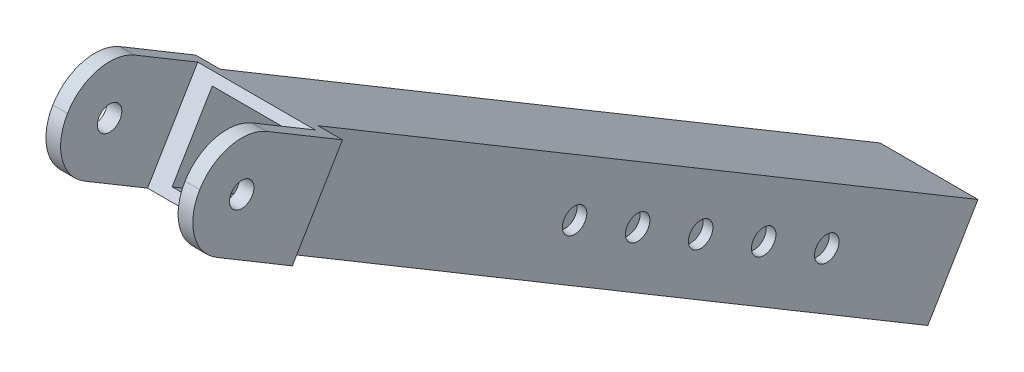
ISO-10303-21;
HEADER;
FILE_DESCRIPTION(('STEP AP214'),'2;1');
FILE_NAME('part.step','',(''),(''),'','','');
FILE_SCHEMA(('AUTOMOTIVE_DESIGN { 1 0 10303 214 1 1 1 1 }'));
ENDSEC;
DATA;
#1=APPLICATION_CONTEXT('core data for automotive mechanical design processes');
#2=APPLICATION_PROTOCOL_DEFINITION('international standard','automotive_design',2000,#1);
#3=PRODUCT_CONTEXT('',#1,'mechanical');
#4=PRODUCT('Part','Part','',(#3));
#5=PRODUCT_RELATED_PRODUCT_CATEGORY('part','',(#4));
#6=PRODUCT_DEFINITION_FORMATION('','',#4);
#7=PRODUCT_DEFINITION_CONTEXT('part definition',#1,'design');
#8=PRODUCT_DEFINITION('design','',#6,#7);
#9=PRODUCT_DEFINITION_SHAPE('','',#8);
#10=(LENGTH_UNIT() NAMED_UNIT(*) SI_UNIT(.MILLI.,.METRE.));
#11=(NAMED_UNIT(*) PLANE_ANGLE_UNIT() SI_UNIT($,.RADIAN.));
#12=(NAMED_UNIT(*) SI_UNIT($,.STERADIAN.) SOLID_ANGLE_UNIT());
#13=UNCERTAINTY_MEASURE_WITH_UNIT(LENGTH_MEASURE(1.E-05),#10,'distance_accuracy_value','');
#14=(GEOMETRIC_REPRESENTATION_CONTEXT(3) GLOBAL_UNCERTAINTY_ASSIGNED_CONTEXT((#13)) GLOBAL_UNIT_ASSIGNED_CONTEXT((#10,
#11,#12)) REPRESENTATION_CONTEXT('',''));
#15=CARTESIAN_POINT('',(0.,0.,0.));
#16=DIRECTION('',(0.,0.,1.));
#17=DIRECTION('',(1.,0.,0.));
#18=AXIS2_PLACEMENT_3D('',#15,#16,#17);
#19=CARTESIAN_POINT('',(0.,-20.5142800548705,-34.3735872736721));
#20=DIRECTION('',(0.,-0.512476118802119,-0.858701477614611));
#21=DIRECTION('',(0.,0.858701477614611,-0.512476118802119));
#22=AXIS2_PLACEMENT_3D('',#19,#20,#21);
#23=PLANE('',#22);
#24=DIRECTION('',(0.,-0.858701477614611,0.512476118802119));
#25=VECTOR('',#24,1.);
#26=CARTESIAN_POINT('',(8.,84.8531726792752,-97.2572606257464));
#27=LINE('',#26,#25);
#28=CARTESIAN_POINT('',(8.,98.592396321109,-105.45687852658));
#29=VERTEX_POINT('',#28);
#30=CARTESIAN_POINT('',(8.,84.8531726792752,-97.2572606257464));
#31=VERTEX_POINT('',#30);
#32=EDGE_CURVE('E350',#29,#31,#27,.T.);
#33=ORIENTED_EDGE('',*,*,#32,.T.);
#34=DIRECTION('',(-1.,0.,0.));
#35=VECTOR('',#34,1.);
#36=CARTESIAN_POINT('',(-8.,84.8531726792752,-97.2572606257464));
#37=LINE('',#36,#35);
#38=CARTESIAN_POINT('',(-8.,84.8531726792752,-97.2572606257464));
#39=VERTEX_POINT('',#38);
#40=EDGE_CURVE('E340',#31,#39,#37,.T.);
#41=ORIENTED_EDGE('',*,*,#40,.T.);
#42=DIRECTION('',(0.,0.858701477614611,-0.512476118802119));
#43=VECTOR('',#42,1.);
#44=CARTESIAN_POINT('',(-8.,84.8531726792752,-97.2572606257464));
#45=LINE('',#44,#43);
#46=CARTESIAN_POINT('',(-8.,98.592396321109,-105.45687852658));
#47=VERTEX_POINT('',#46);
#48=EDGE_CURVE('E343',#39,#47,#45,.T.);
#49=ORIENTED_EDGE('',*,*,#48,.T.);
#50=DIRECTION('',(1.,0.,0.));
#51=VECTOR('',#50,1.);
#52=CARTESIAN_POINT('',(-8.,98.592396321109,-105.45687852658));
#53=LINE('',#52,#51);
#54=EDGE_CURVE('E347',#47,#29,#53,.T.);
#55=ORIENTED_EDGE('',*,*,#54,.T.);
#56=EDGE_LOOP('',(#33,#41,#49,#55));
#57=FACE_BOUND('',#56,.T.);
#58=DIRECTION('',(0.,-0.858701477614611,0.512476118802119));
#59=VECTOR('',#58,1.);
#60=CARTESIAN_POINT('',(12.,100.309799276338,-106.481830764185));
#61=LINE('',#60,#59);
#62=CARTESIAN_POINT('',(12.,100.309799276338,-106.481830764184));
#63=VERTEX_POINT('',#62);
#64=CARTESIAN_POINT('',(12.,83.135769724046,-96.2323083881421));
#65=VERTEX_POINT('',#64);
#66=EDGE_CURVE('E273',#63,#65,#61,.T.);
#67=ORIENTED_EDGE('',*,*,#66,.F.);
#68=DIRECTION('',(1.,0.,0.));
#69=VECTOR('',#68,1.);
#70=CARTESIAN_POINT('',(-10.,100.309799276338,-106.481830764184));
#71=LINE('',#70,#69);
#72=CARTESIAN_POINT('',(-12.,100.309799276338,-106.481830764184));
#73=VERTEX_POINT('',#72);
#74=EDGE_CURVE('E209',#73,#63,#71,.T.);
#75=ORIENTED_EDGE('',*,*,#74,.F.);
#76=DIRECTION('',(0.,0.858701477614611,-0.512476118802119));
#77=VECTOR('',#76,1.);
#78=CARTESIAN_POINT('',(-12.,100.309799276338,-106.481830764185));
#79=LINE('',#78,#77);
#80=CARTESIAN_POINT('',(-12.,83.135769724046,-96.2323083881421));
#81=VERTEX_POINT('',#80);
#82=EDGE_CURVE('E276',#81,#73,#79,.T.);
#83=ORIENTED_EDGE('',*,*,#82,.F.);
#84=DIRECTION('',(-1.,0.,0.));
#85=VECTOR('',#84,1.);
#86=CARTESIAN_POINT('',(-10.,83.135769724046,-96.2323083881421));
#87=LINE('',#86,#85);
#88=EDGE_CURVE('E371',#65,#81,#87,.T.);
#89=ORIENTED_EDGE('',*,*,#88,.F.);
#90=EDGE_LOOP('',(#67,#75,#83,#89));
#91=FACE_BOUND('',#90,.T.);
#92=ADVANCED_FACE('F41',(#57,#91),#23,.F.);
#93=CARTESIAN_POINT('',(10.,83.135769724046,-96.2323083881421));
#94=DIRECTION('',(1.,0.,0.));
#95=DIRECTION('',(0.,0.,-1.));
#96=AXIS2_PLACEMENT_3D('',#93,#94,#95);
#97=PLANE('',#96);
#98=CARTESIAN_POINT('',(10.,25.1008890559165,-212.988261666063));
#99=DIRECTION('',(1.,0.,0.));
#100=DIRECTION('',(0.,0.,-1.));
#101=AXIS2_PLACEMENT_3D('',#98,#99,#100);
#102=CIRCLE('',#101,2.5);
#103=CARTESIAN_POINT('',(10.,25.1008890559165,-215.488261666063));
#104=VERTEX_POINT('',#103);
#105=EDGE_CURVE('E229',#104,#104,#102,.T.);
#106=ORIENTED_EDGE('',*,*,#105,.F.);
#107=EDGE_LOOP('',(#106));
#108=FACE_BOUND('',#107,.T.);
#109=CARTESIAN_POINT('',(10.,32.7880308379483,-200.107739501844));
#110=DIRECTION('',(1.,0.,0.));
#111=DIRECTION('',(0.,0.,-1.));
#112=AXIS2_PLACEMENT_3D('',#109,#110,#111);
#113=CIRCLE('',#112,2.5);
#114=CARTESIAN_POINT('',(10.,32.7880308379483,-202.607739501844));
#115=VERTEX_POINT('',#114);
#116=EDGE_CURVE('E224',#115,#115,#113,.T.);
#117=ORIENTED_EDGE('',*,*,#116,.F.);
#118=EDGE_LOOP('',(#117));
#119=FACE_BOUND('',#118,.T.);
#120=CARTESIAN_POINT('',(10.,40.4751726199801,-187.227217337624));
#121=DIRECTION('',(1.,0.,0.));
#122=DIRECTION('',(0.,0.,-1.));
#123=AXIS2_PLACEMENT_3D('',#120,#121,#122);
#124=CIRCLE('',#123,2.5);
#125=CARTESIAN_POINT('',(10.,40.4751726199801,-189.727217337624));
#126=VERTEX_POINT('',#125);
#127=EDGE_CURVE('E219',#126,#126,#124,.T.);
#128=ORIENTED_EDGE('',*,*,#127,.F.);
#129=EDGE_LOOP('',(#128));
#130=FACE_BOUND('',#129,.T.);
#131=CARTESIAN_POINT('',(10.,48.1623144020119,-174.346695173405));
#132=DIRECTION('',(1.,0.,0.));
#133=DIRECTION('',(0.,0.,-1.));
#134=AXIS2_PLACEMENT_3D('',#131,#132,#133);
#135=CIRCLE('',#134,2.5);
#136=CARTESIAN_POINT('',(10.,48.1623144020119,-176.846695173405));
#137=VERTEX_POINT('',#136);
#138=EDGE_CURVE('E214',#137,#137,#135,.T.);
#139=ORIENTED_EDGE('',*,*,#138,.F.);
#140=EDGE_LOOP('',(#139));
#141=FACE_BOUND('',#140,.T.);
#142=CARTESIAN_POINT('',(10.,55.8494561840437,-161.466173009186));
#143=DIRECTION('',(1.,0.,0.));
#144=DIRECTION('',(0.,0.,-1.));
#145=AXIS2_PLACEMENT_3D('',#142,#143,#144);
#146=CIRCLE('',#145,2.5);
#147=CARTESIAN_POINT('',(10.,55.8494561840437,-163.966173009186));
#148=VERTEX_POINT('',#147);
#149=EDGE_CURVE('E336',#148,#148,#146,.T.);
#150=ORIENTED_EDGE('',*,*,#149,.F.);
#151=EDGE_LOOP('',(#150));
#152=FACE_BOUND('',#151,.T.);
#153=DIRECTION('',(0.,-0.512476118802119,-0.858701477614611));
#154=VECTOR('',#153,1.);
#155=CARTESIAN_POINT('',(10.,100.309799276338,-106.481830764184));
#156=LINE('',#155,#154);
#157=CARTESIAN_POINT('',(10.,98.7723709199318,-109.057935197028));
#158=VERTEX_POINT('',#157);
#159=CARTESIAN_POINT('',(10.,18.3136202679991,-243.874067182522));
#160=VERTEX_POINT('',#159);
#161=EDGE_CURVE('E183',#158,#160,#156,.T.);
#162=ORIENTED_EDGE('',*,*,#161,.F.);
#163=DIRECTION('',(0.,-0.858701477614611,0.512476118802119));
#164=VECTOR('',#163,1.);
#165=CARTESIAN_POINT('',(10.,81.5983413676396,-98.808412820986));
#166=LINE('',#165,#164);
#167=CARTESIAN_POINT('',(10.,81.5983413676396,-98.808412820986));
#168=VERTEX_POINT('',#167);
#169=EDGE_CURVE('E167',#158,#168,#166,.T.);
#170=ORIENTED_EDGE('',*,*,#169,.T.);
#171=DIRECTION('',(0.,-0.512476118802119,-0.858701477614611));
#172=VECTOR('',#171,1.);
#173=CARTESIAN_POINT('',(10.,83.135769724046,-96.2323083881421));
#174=LINE('',#173,#172);
#175=CARTESIAN_POINT('',(10.,1.13959071570686,-233.62454480648));
#176=VERTEX_POINT('',#175);
#177=EDGE_CURVE('E207',#168,#176,#174,.T.);
#178=ORIENTED_EDGE('',*,*,#177,.T.);
#179=DIRECTION('',(0.,-0.858701477614611,0.512476118802119));
#180=VECTOR('',#179,1.);
#181=CARTESIAN_POINT('',(10.,1.13959071570686,-233.62454480648));
#182=LINE('',#181,#180);
#183=EDGE_CURVE('E193',#160,#176,#182,.T.);
#184=ORIENTED_EDGE('',*,*,#183,.F.);
#185=EDGE_LOOP('',(#162,#170,#178,#184));
#186=FACE_BOUND('',#185,.T.);
#187=ADVANCED_FACE('F191',(#108,#119,#130,#141,#152,#186),#97,.T.);
#188=CARTESIAN_POINT('',(-10.,83.135769724046,-96.2323083881421));
#189=DIRECTION('',(-1.,0.,0.));
#190=DIRECTION('',(0.,0.,1.));
#191=AXIS2_PLACEMENT_3D('',#188,#189,#190);
#192=PLANE('',#191);
#193=CARTESIAN_POINT('',(-10.,25.1008890559165,-212.988261666063));
#194=DIRECTION('',(-1.,0.,0.));
#195=DIRECTION('',(0.,0.,1.));
#196=AXIS2_PLACEMENT_3D('',#193,#194,#195);
#197=CIRCLE('',#196,2.5);
#198=CARTESIAN_POINT('',(-10.,25.1008890559165,-210.488261666063));
#199=VERTEX_POINT('',#198);
#200=EDGE_CURVE('E305',#199,#199,#197,.T.);
#201=ORIENTED_EDGE('',*,*,#200,.F.);
#202=EDGE_LOOP('',(#201));
#203=FACE_BOUND('',#202,.T.);
#204=CARTESIAN_POINT('',(-10.,32.7880308379483,-200.107739501844));
#205=DIRECTION('',(-1.,0.,0.));
#206=DIRECTION('',(0.,0.,1.));
#207=AXIS2_PLACEMENT_3D('',#204,#205,#206);
#208=CIRCLE('',#207,2.5);
#209=CARTESIAN_POINT('',(-10.,32.7880308379483,-197.607739501844));
#210=VERTEX_POINT('',#209);
#211=EDGE_CURVE('E312',#210,#210,#208,.T.);
#212=ORIENTED_EDGE('',*,*,#211,.F.);
#213=EDGE_LOOP('',(#212));
#214=FACE_BOUND('',#213,.T.);
#215=CARTESIAN_POINT('',(-10.,40.4751726199801,-187.227217337624));
#216=DIRECTION('',(-1.,0.,0.));
#217=DIRECTION('',(0.,0.,1.));
#218=AXIS2_PLACEMENT_3D('',#215,#216,#217);
#219=CIRCLE('',#218,2.5);
#220=CARTESIAN_POINT('',(-10.,40.4751726199801,-184.727217337624));
#221=VERTEX_POINT('',#220);
#222=EDGE_CURVE('E319',#221,#221,#219,.T.);
#223=ORIENTED_EDGE('',*,*,#222,.F.);
#224=EDGE_LOOP('',(#223));
#225=FACE_BOUND('',#224,.T.);
#226=CARTESIAN_POINT('',(-10.,48.1623144020119,-174.346695173405));
#227=DIRECTION('',(-1.,0.,0.));
#228=DIRECTION('',(0.,0.,1.));
#229=AXIS2_PLACEMENT_3D('',#226,#227,#228);
#230=CIRCLE('',#229,2.5);
#231=CARTESIAN_POINT('',(-10.,48.1623144020119,-171.846695173405));
#232=VERTEX_POINT('',#231);
#233=EDGE_CURVE('E326',#232,#232,#230,.T.);
#234=ORIENTED_EDGE('',*,*,#233,.F.);
#235=EDGE_LOOP('',(#234));
#236=FACE_BOUND('',#235,.T.);
#237=CARTESIAN_POINT('',(-10.,55.8494561840437,-161.466173009186));
#238=DIRECTION('',(-1.,0.,0.));
#239=DIRECTION('',(0.,0.,1.));
#240=AXIS2_PLACEMENT_3D('',#237,#238,#239);
#241=CIRCLE('',#240,2.5);
#242=CARTESIAN_POINT('',(-10.,55.8494561840437,-158.966173009186));
#243=VERTEX_POINT('',#242);
#244=EDGE_CURVE('E333',#243,#243,#241,.T.);
#245=ORIENTED_EDGE('',*,*,#244,.F.);
#246=EDGE_LOOP('',(#245));
#247=FACE_BOUND('',#246,.T.);
#248=DIRECTION('',(0.,-0.512476118802119,-0.858701477614611));
#249=VECTOR('',#248,1.);
#250=CARTESIAN_POINT('',(-10.,83.135769724046,-96.2323083881421));
#251=LINE('',#250,#249);
#252=CARTESIAN_POINT('',(-10.,81.5983413676396,-98.808412820986));
#253=VERTEX_POINT('',#252);
#254=CARTESIAN_POINT('',(-10.,1.13959071570686,-233.62454480648));
#255=VERTEX_POINT('',#254);
#256=EDGE_CURVE('E200',#253,#255,#251,.T.);
#257=ORIENTED_EDGE('',*,*,#256,.F.);
#258=DIRECTION('',(0.,0.858701477614611,-0.512476118802119));
#259=VECTOR('',#258,1.);
#260=CARTESIAN_POINT('',(-10.,81.5983413676396,-98.808412820986));
#261=LINE('',#260,#259);
#262=CARTESIAN_POINT('',(-10.,98.7723709199318,-109.057935197028));
#263=VERTEX_POINT('',#262);
#264=EDGE_CURVE('E177',#253,#263,#261,.T.);
#265=ORIENTED_EDGE('',*,*,#264,.T.);
#266=DIRECTION('',(0.,-0.512476118802119,-0.858701477614611));
#267=VECTOR('',#266,1.);
#268=CARTESIAN_POINT('',(-10.,100.309799276338,-106.481830764184));
#269=LINE('',#268,#267);
#270=CARTESIAN_POINT('',(-10.,18.3136202679991,-243.874067182522));
#271=VERTEX_POINT('',#270);
#272=EDGE_CURVE('E196',#263,#271,#269,.T.);
#273=ORIENTED_EDGE('',*,*,#272,.T.);
#274=DIRECTION('',(0.,0.858701477614611,-0.512476118802119));
#275=VECTOR('',#274,1.);
#276=CARTESIAN_POINT('',(-10.,1.13959071570686,-233.62454480648));
#277=LINE('',#276,#275);
#278=EDGE_CURVE('E379',#255,#271,#277,.T.);
#279=ORIENTED_EDGE('',*,*,#278,.F.);
#280=EDGE_LOOP('',(#257,#265,#273,#279));
#281=FACE_BOUND('',#280,.T.);
#282=ADVANCED_FACE('F387',(#203,#214,#225,#236,#247,#281),#192,.T.);
#283=CARTESIAN_POINT('',(-10.,100.309799276338,-106.481830764184));
#284=DIRECTION('',(0.,0.858701477614611,-0.512476118802119));
#285=DIRECTION('',(0.,0.512476118802119,0.858701477614611));
#286=AXIS2_PLACEMENT_3D('',#283,#284,#285);
#287=PLANE('',#286);
#288=DIRECTION('',(0.,0.512476118802119,0.858701477614611));
#289=VECTOR('',#288,1.);
#290=CARTESIAN_POINT('',(-15.,98.7723709199318,-109.057935197028));
#291=LINE('',#290,#289);
#292=CARTESIAN_POINT('',(-15.,98.7723709199318,-109.057935197028));
#293=VERTEX_POINT('',#292);
#294=CARTESIAN_POINT('',(-15.,107.99694105837,-93.6013085999654));
#295=VERTEX_POINT('',#294);
#296=EDGE_CURVE('E299',#293,#295,#291,.T.);
#297=ORIENTED_EDGE('',*,*,#296,.T.);
#298=DIRECTION('',(-1.,0.,0.));
#299=VECTOR('',#298,1.);
#300=CARTESIAN_POINT('',(-10.,107.99694105837,-93.6013085999654));
#301=LINE('',#300,#299);
#302=CARTESIAN_POINT('',(-12.,107.99694105837,-93.6013085999654));
#303=VERTEX_POINT('',#302);
#304=EDGE_CURVE('E247',#295,#303,#301,.F.);
#305=ORIENTED_EDGE('',*,*,#304,.T.);
#306=DIRECTION('',(0.,-0.512476118802119,-0.858701477614611));
#307=VECTOR('',#306,1.);
#308=CARTESIAN_POINT('',(-12.,113.121702246391,-85.0142938238192));
#309=LINE('',#308,#307);
#310=EDGE_CURVE('E279',#303,#73,#309,.T.);
#311=ORIENTED_EDGE('',*,*,#310,.T.);
#312=ORIENTED_EDGE('',*,*,#74,.T.);
#313=DIRECTION('',(0.,-0.512476118802119,-0.858701477614611));
#314=VECTOR('',#313,1.);
#315=CARTESIAN_POINT('',(12.,113.121702246391,-85.0142938238192));
#316=LINE('',#315,#314);
#317=CARTESIAN_POINT('',(12.,107.99694105837,-93.6013085999654));
#318=VERTEX_POINT('',#317);
#319=EDGE_CURVE('E255',#318,#63,#316,.T.);
#320=ORIENTED_EDGE('',*,*,#319,.F.);
#321=DIRECTION('',(-1.,0.,0.));
#322=VECTOR('',#321,1.);
#323=CARTESIAN_POINT('',(15.,107.99694105837,-93.6013085999654));
#324=LINE('',#323,#322);
#325=CARTESIAN_POINT('',(15.,107.99694105837,-93.6013085999654));
#326=VERTEX_POINT('',#325);
#327=EDGE_CURVE('E245',#318,#326,#324,.F.);
#328=ORIENTED_EDGE('',*,*,#327,.T.);
#329=DIRECTION('',(0.,0.512476118802119,0.858701477614611));
#330=VECTOR('',#329,1.);
#331=CARTESIAN_POINT('',(15.,98.7723709199318,-109.057935197028));
#332=LINE('',#331,#330);
#333=CARTESIAN_POINT('',(15.,98.7723709199318,-109.057935197028));
#334=VERTEX_POINT('',#333);
#335=EDGE_CURVE('E186',#334,#326,#332,.T.);
#336=ORIENTED_EDGE('',*,*,#335,.F.);
#337=DIRECTION('',(-1.,0.,0.));
#338=VECTOR('',#337,1.);
#339=CARTESIAN_POINT('',(10.,98.7723709199318,-109.057935197028));
#340=LINE('',#339,#338);
#341=EDGE_CURVE('E171',#334,#158,#340,.T.);
#342=ORIENTED_EDGE('',*,*,#341,.T.);
#343=ORIENTED_EDGE('',*,*,#161,.T.);
#344=DIRECTION('',(1.,0.,0.));
#345=VECTOR('',#344,1.);
#346=CARTESIAN_POINT('',(-10.,18.3136202679991,-243.874067182522));
#347=LINE('',#346,#345);
#348=EDGE_CURVE('E203',#271,#160,#347,.T.);
#349=ORIENTED_EDGE('',*,*,#348,.F.);
#350=ORIENTED_EDGE('',*,*,#272,.F.);
#351=DIRECTION('',(-1.,0.,0.));
#352=VECTOR('',#351,1.);
#353=CARTESIAN_POINT('',(-10.,98.7723709199318,-109.057935197028));
#354=LINE('',#353,#352);
#355=EDGE_CURVE('E290',#263,#293,#354,.T.);
#356=ORIENTED_EDGE('',*,*,#355,.T.);
#357=EDGE_LOOP('',(#297,#305,#311,#312,#320,#328,#336,#342,#343,#349,#350,#356));
#358=FACE_BOUND('',#357,.T.);
#359=ADVANCED_FACE('F181',(#358),#287,.T.);
#360=CARTESIAN_POINT('',(-10.,83.135769724046,-96.2323083881421));
#361=DIRECTION('',(0.,-0.858701477614611,0.512476118802119));
#362=DIRECTION('',(0.,-0.512476118802119,-0.858701477614611));
#363=AXIS2_PLACEMENT_3D('',#360,#361,#362);
#364=PLANE('',#363);
#365=DIRECTION('',(0.,-0.512476118802119,-0.858701477614611));
#366=VECTOR('',#365,1.);
#367=CARTESIAN_POINT('',(-12.,95.9476726940989,-74.7647714477769));
#368=LINE('',#367,#366);
#369=CARTESIAN_POINT('',(-12.,90.8229115060777,-83.351786223923));
#370=VERTEX_POINT('',#369);
#371=EDGE_CURVE('E281',#370,#81,#368,.T.);
#372=ORIENTED_EDGE('',*,*,#371,.F.);
#373=DIRECTION('',(1.,0.,0.));
#374=VECTOR('',#373,1.);
#375=CARTESIAN_POINT('',(-10.,90.8229115060778,-83.351786223923));
#376=LINE('',#375,#374);
#377=CARTESIAN_POINT('',(-15.,90.8229115060777,-83.351786223923));
#378=VERTEX_POINT('',#377);
#379=EDGE_CURVE('E238',#370,#378,#376,.F.);
#380=ORIENTED_EDGE('',*,*,#379,.T.);
#381=DIRECTION('',(0.,0.512476118802119,0.858701477614611));
#382=VECTOR('',#381,1.);
#383=CARTESIAN_POINT('',(-15.,81.5983413676396,-98.808412820986));
#384=LINE('',#383,#382);
#385=CARTESIAN_POINT('',(-15.,81.5983413676396,-98.808412820986));
#386=VERTEX_POINT('',#385);
#387=EDGE_CURVE('E233',#386,#378,#384,.T.);
#388=ORIENTED_EDGE('',*,*,#387,.F.);
#389=DIRECTION('',(1.,0.,0.));
#390=VECTOR('',#389,1.);
#391=CARTESIAN_POINT('',(-10.,81.5983413676396,-98.808412820986));
#392=LINE('',#391,#390);
#393=EDGE_CURVE('E296',#386,#253,#392,.T.);
#394=ORIENTED_EDGE('',*,*,#393,.T.);
#395=ORIENTED_EDGE('',*,*,#256,.T.);
#396=DIRECTION('',(-1.,0.,0.));
#397=VECTOR('',#396,1.);
#398=CARTESIAN_POINT('',(-10.,1.13959071570686,-233.62454480648));
#399=LINE('',#398,#397);
#400=EDGE_CURVE('E377',#176,#255,#399,.T.);
#401=ORIENTED_EDGE('',*,*,#400,.F.);
#402=ORIENTED_EDGE('',*,*,#177,.F.);
#403=DIRECTION('',(1.,0.,0.));
#404=VECTOR('',#403,1.);
#405=CARTESIAN_POINT('',(15.,81.5983413676396,-98.808412820986));
#406=LINE('',#405,#404);
#407=CARTESIAN_POINT('',(15.,81.5983413676396,-98.808412820986));
#408=VERTEX_POINT('',#407);
#409=EDGE_CURVE('E173',#168,#408,#406,.T.);
#410=ORIENTED_EDGE('',*,*,#409,.T.);
#411=DIRECTION('',(0.,0.512476118802119,0.858701477614611));
#412=VECTOR('',#411,1.);
#413=CARTESIAN_POINT('',(15.,81.5983413676396,-98.808412820986));
#414=LINE('',#413,#412);
#415=CARTESIAN_POINT('',(15.,90.8229115060777,-83.351786223923));
#416=VERTEX_POINT('',#415);
#417=EDGE_CURVE('E189',#408,#416,#414,.T.);
#418=ORIENTED_EDGE('',*,*,#417,.T.);
#419=DIRECTION('',(1.,0.,0.));
#420=VECTOR('',#419,1.);
#421=CARTESIAN_POINT('',(12.,90.8229115060778,-83.351786223923));
#422=LINE('',#421,#420);
#423=CARTESIAN_POINT('',(12.,90.8229115060777,-83.351786223923));
#424=VERTEX_POINT('',#423);
#425=EDGE_CURVE('E236',#416,#424,#422,.F.);
#426=ORIENTED_EDGE('',*,*,#425,.T.);
#427=DIRECTION('',(0.,-0.512476118802119,-0.858701477614611));
#428=VECTOR('',#427,1.);
#429=CARTESIAN_POINT('',(12.,95.9476726940989,-74.7647714477769));
#430=LINE('',#429,#428);
#431=EDGE_CURVE('E271',#424,#65,#430,.T.);
#432=ORIENTED_EDGE('',*,*,#431,.T.);
#433=ORIENTED_EDGE('',*,*,#88,.T.);
#434=EDGE_LOOP('',(#372,#380,#388,#394,#395,#401,#402,#410,#418,#426,#432,#433));
#435=FACE_BOUND('',#434,.T.);
#436=ADVANCED_FACE('F394',(#435),#364,.T.);
#437=CARTESIAN_POINT('',(0.,-102.51045906321,-171.76582369201));
#438=DIRECTION('',(0.,-0.512476118802119,-0.858701477614611));
#439=DIRECTION('',(0.,0.858701477614611,-0.512476118802119));
#440=AXIS2_PLACEMENT_3D('',#437,#438,#439);
#441=PLANE('',#440);
#442=DIRECTION('',(-1.,0.,0.));
#443=VECTOR('',#442,1.);
#444=CARTESIAN_POINT('',(-8.,2.85699367093608,-234.649497044084));
#445=LINE('',#444,#443);
#446=CARTESIAN_POINT('',(8.,2.85699367093608,-234.649497044084));
#447=VERTEX_POINT('',#446);
#448=CARTESIAN_POINT('',(-8.,2.85699367093609,-234.649497044084));
#449=VERTEX_POINT('',#448);
#450=EDGE_CURVE('E339',#447,#449,#445,.T.);
#451=ORIENTED_EDGE('',*,*,#450,.F.);
#452=DIRECTION('',(0.,-0.858701477614611,0.512476118802119));
#453=VECTOR('',#452,1.);
#454=CARTESIAN_POINT('',(8.,2.85699367093608,-234.649497044084));
#455=LINE('',#454,#453);
#456=CARTESIAN_POINT('',(8.,16.5962173127699,-242.849114944918));
#457=VERTEX_POINT('',#456);
#458=EDGE_CURVE('E344',#457,#447,#455,.T.);
#459=ORIENTED_EDGE('',*,*,#458,.F.);
#460=DIRECTION('',(1.,0.,0.));
#461=VECTOR('',#460,1.);
#462=CARTESIAN_POINT('',(-8.,16.5962173127699,-242.849114944918));
#463=LINE('',#462,#461);
#464=CARTESIAN_POINT('',(-8.,16.5962173127699,-242.849114944918));
#465=VERTEX_POINT('',#464);
#466=EDGE_CURVE('E358',#465,#457,#463,.T.);
#467=ORIENTED_EDGE('',*,*,#466,.F.);
#468=DIRECTION('',(0.,0.858701477614611,-0.512476118802119));
#469=VECTOR('',#468,1.);
#470=CARTESIAN_POINT('',(-8.,2.85699367093608,-234.649497044084));
#471=LINE('',#470,#469);
#472=EDGE_CURVE('E355',#449,#465,#471,.T.);
#473=ORIENTED_EDGE('',*,*,#472,.F.);
#474=EDGE_LOOP('',(#451,#459,#467,#473));
#475=FACE_BOUND('',#474,.T.);
#476=ORIENTED_EDGE('',*,*,#183,.T.);
#477=ORIENTED_EDGE('',*,*,#400,.T.);
#478=ORIENTED_EDGE('',*,*,#278,.T.);
#479=ORIENTED_EDGE('',*,*,#348,.T.);
#480=EDGE_LOOP('',(#476,#477,#478,#479));
#481=FACE_BOUND('',#480,.T.);
#482=ADVANCED_FACE('F383',(#475,#481),#441,.T.);
#483=CARTESIAN_POINT('',(-8.,84.8531726792752,-97.2572606257464));
#484=DIRECTION('',(0.,-0.858701477614611,0.512476118802119));
#485=DIRECTION('',(0.,-0.512476118802119,-0.858701477614611));
#486=AXIS2_PLACEMENT_3D('',#483,#484,#485);
#487=PLANE('',#486);
#488=ORIENTED_EDGE('',*,*,#450,.T.);
#489=DIRECTION('',(0.,-0.512476118802119,-0.858701477614611));
#490=VECTOR('',#489,1.);
#491=CARTESIAN_POINT('',(-8.,84.8531726792752,-97.2572606257464));
#492=LINE('',#491,#490);
#493=EDGE_CURVE('E353',#39,#449,#492,.T.);
#494=ORIENTED_EDGE('',*,*,#493,.F.);
#495=ORIENTED_EDGE('',*,*,#40,.F.);
#496=DIRECTION('',(0.,-0.512476118802119,-0.858701477614611));
#497=VECTOR('',#496,1.);
#498=CARTESIAN_POINT('',(8.,84.8531726792752,-97.2572606257464));
#499=LINE('',#498,#497);
#500=EDGE_CURVE('E363',#31,#447,#499,.T.);
#501=ORIENTED_EDGE('',*,*,#500,.T.);
#502=EDGE_LOOP('',(#488,#494,#495,#501));
#503=FACE_BOUND('',#502,.T.);
#504=ADVANCED_FACE('F442',(#503),#487,.F.);
#505=CARTESIAN_POINT('',(8.,84.8531726792752,-97.2572606257464));
#506=DIRECTION('',(1.,0.,0.));
#507=DIRECTION('',(0.,1.,0.));
#508=AXIS2_PLACEMENT_3D('',#505,#506,#507);
#509=PLANE('',#508);
#510=CARTESIAN_POINT('',(8.,25.1008890559165,-212.988261666063));
#511=DIRECTION('',(1.,0.,0.));
#512=DIRECTION('',(0.,1.,0.));
#513=AXIS2_PLACEMENT_3D('',#510,#511,#512);
#514=CIRCLE('',#513,2.5);
#515=CARTESIAN_POINT('',(8.,27.6008890559165,-212.988261666063));
#516=VERTEX_POINT('',#515);
#517=EDGE_CURVE('E232',#516,#516,#514,.T.);
#518=ORIENTED_EDGE('',*,*,#517,.T.);
#519=EDGE_LOOP('',(#518));
#520=FACE_BOUND('',#519,.T.);
#521=CARTESIAN_POINT('',(8.,32.7880308379483,-200.107739501844));
#522=DIRECTION('',(1.,0.,0.));
#523=DIRECTION('',(0.,1.,0.));
#524=AXIS2_PLACEMENT_3D('',#521,#522,#523);
#525=CIRCLE('',#524,2.5);
#526=CARTESIAN_POINT('',(8.,35.2880308379483,-200.107739501844));
#527=VERTEX_POINT('',#526);
#528=EDGE_CURVE('E228',#527,#527,#525,.T.);
#529=ORIENTED_EDGE('',*,*,#528,.T.);
#530=EDGE_LOOP('',(#529));
#531=FACE_BOUND('',#530,.T.);
#532=CARTESIAN_POINT('',(8.,40.4751726199801,-187.227217337624));
#533=DIRECTION('',(1.,0.,0.));
#534=DIRECTION('',(0.,1.,0.));
#535=AXIS2_PLACEMENT_3D('',#532,#533,#534);
#536=CIRCLE('',#535,2.5);
#537=CARTESIAN_POINT('',(8.,42.9751726199801,-187.227217337624));
#538=VERTEX_POINT('',#537);
#539=EDGE_CURVE('E223',#538,#538,#536,.T.);
#540=ORIENTED_EDGE('',*,*,#539,.T.);
#541=EDGE_LOOP('',(#540));
#542=FACE_BOUND('',#541,.T.);
#543=CARTESIAN_POINT('',(8.,48.1623144020119,-174.346695173405));
#544=DIRECTION('',(1.,0.,0.));
#545=DIRECTION('',(0.,1.,0.));
#546=AXIS2_PLACEMENT_3D('',#543,#544,#545);
#547=CIRCLE('',#546,2.5);
#548=CARTESIAN_POINT('',(8.,50.6623144020119,-174.346695173405));
#549=VERTEX_POINT('',#548);
#550=EDGE_CURVE('E218',#549,#549,#547,.T.);
#551=ORIENTED_EDGE('',*,*,#550,.T.);
#552=EDGE_LOOP('',(#551));
#553=FACE_BOUND('',#552,.T.);
#554=CARTESIAN_POINT('',(8.,55.8494561840437,-161.466173009186));
#555=DIRECTION('',(1.,0.,0.));
#556=DIRECTION('',(0.,1.,0.));
#557=AXIS2_PLACEMENT_3D('',#554,#555,#556);
#558=CIRCLE('',#557,2.5);
#559=CARTESIAN_POINT('',(8.,58.3494561840437,-161.466173009186));
#560=VERTEX_POINT('',#559);
#561=EDGE_CURVE('E213',#560,#560,#558,.T.);
#562=ORIENTED_EDGE('',*,*,#561,.T.);
#563=EDGE_LOOP('',(#562));
#564=FACE_BOUND('',#563,.T.);
#565=ORIENTED_EDGE('',*,*,#458,.T.);
#566=ORIENTED_EDGE('',*,*,#500,.F.);
#567=ORIENTED_EDGE('',*,*,#32,.F.);
#568=DIRECTION('',(0.,-0.512476118802119,-0.858701477614611));
#569=VECTOR('',#568,1.);
#570=CARTESIAN_POINT('',(8.,98.592396321109,-105.45687852658));
#571=LINE('',#570,#569);
#572=EDGE_CURVE('E365',#29,#457,#571,.T.);
#573=ORIENTED_EDGE('',*,*,#572,.T.);
#574=EDGE_LOOP('',(#565,#566,#567,#573));
#575=FACE_BOUND('',#574,.T.);
#576=ADVANCED_FACE('F507',(#520,#531,#542,#553,#564,#575),#509,.F.);
#577=CARTESIAN_POINT('',(-8.,98.592396321109,-105.45687852658));
#578=DIRECTION('',(0.,0.858701477614611,-0.512476118802119));
#579=DIRECTION('',(0.,0.512476118802119,0.858701477614611));
#580=AXIS2_PLACEMENT_3D('',#577,#578,#579);
#581=PLANE('',#580);
#582=ORIENTED_EDGE('',*,*,#466,.T.);
#583=ORIENTED_EDGE('',*,*,#572,.F.);
#584=ORIENTED_EDGE('',*,*,#54,.F.);
#585=DIRECTION('',(0.,-0.512476118802119,-0.858701477614611));
#586=VECTOR('',#585,1.);
#587=CARTESIAN_POINT('',(-8.,98.592396321109,-105.45687852658));
#588=LINE('',#587,#586);
#589=EDGE_CURVE('E367',#47,#465,#588,.T.);
#590=ORIENTED_EDGE('',*,*,#589,.T.);
#591=EDGE_LOOP('',(#582,#583,#584,#590));
#592=FACE_BOUND('',#591,.T.);
#593=ADVANCED_FACE('F510',(#592),#581,.F.);
#594=CARTESIAN_POINT('',(-8.,84.8531726792752,-97.2572606257464));
#595=DIRECTION('',(-1.,0.,0.));
#596=DIRECTION('',(0.,0.,1.));
#597=AXIS2_PLACEMENT_3D('',#594,#595,#596);
#598=PLANE('',#597);
#599=CARTESIAN_POINT('',(-8.,25.1008890559165,-212.988261666063));
#600=DIRECTION('',(-1.,0.,0.));
#601=DIRECTION('',(0.,0.,1.));
#602=AXIS2_PLACEMENT_3D('',#599,#600,#601);
#603=CIRCLE('',#602,2.5);
#604=CARTESIAN_POINT('',(-8.,25.1008890559165,-210.488261666063));
#605=VERTEX_POINT('',#604);
#606=EDGE_CURVE('E230',#605,#605,#603,.T.);
#607=ORIENTED_EDGE('',*,*,#606,.T.);
#608=EDGE_LOOP('',(#607));
#609=FACE_BOUND('',#608,.T.);
#610=CARTESIAN_POINT('',(-8.,32.7880308379483,-200.107739501844));
#611=DIRECTION('',(-1.,0.,0.));
#612=DIRECTION('',(0.,0.,1.));
#613=AXIS2_PLACEMENT_3D('',#610,#611,#612);
#614=CIRCLE('',#613,2.5);
#615=CARTESIAN_POINT('',(-8.,32.7880308379483,-197.607739501844));
#616=VERTEX_POINT('',#615);
#617=EDGE_CURVE('E225',#616,#616,#614,.T.);
#618=ORIENTED_EDGE('',*,*,#617,.T.);
#619=EDGE_LOOP('',(#618));
#620=FACE_BOUND('',#619,.T.);
#621=CARTESIAN_POINT('',(-8.,40.4751726199801,-187.227217337624));
#622=DIRECTION('',(-1.,0.,0.));
#623=DIRECTION('',(0.,0.,1.));
#624=AXIS2_PLACEMENT_3D('',#621,#622,#623);
#625=CIRCLE('',#624,2.5);
#626=CARTESIAN_POINT('',(-8.,40.4751726199801,-184.727217337624));
#627=VERTEX_POINT('',#626);
#628=EDGE_CURVE('E220',#627,#627,#625,.T.);
#629=ORIENTED_EDGE('',*,*,#628,.T.);
#630=EDGE_LOOP('',(#629));
#631=FACE_BOUND('',#630,.T.);
#632=CARTESIAN_POINT('',(-8.,48.1623144020119,-174.346695173405));
#633=DIRECTION('',(-1.,0.,0.));
#634=DIRECTION('',(0.,0.,1.));
#635=AXIS2_PLACEMENT_3D('',#632,#633,#634);
#636=CIRCLE('',#635,2.5);
#637=CARTESIAN_POINT('',(-8.,48.1623144020119,-171.846695173405));
#638=VERTEX_POINT('',#637);
#639=EDGE_CURVE('E215',#638,#638,#636,.T.);
#640=ORIENTED_EDGE('',*,*,#639,.T.);
#641=EDGE_LOOP('',(#640));
#642=FACE_BOUND('',#641,.T.);
#643=CARTESIAN_POINT('',(-8.,55.8494561840437,-161.466173009186));
#644=DIRECTION('',(-1.,0.,0.));
#645=DIRECTION('',(0.,0.,1.));
#646=AXIS2_PLACEMENT_3D('',#643,#644,#645);
#647=CIRCLE('',#646,2.5);
#648=CARTESIAN_POINT('',(-8.,55.8494561840437,-158.966173009186));
#649=VERTEX_POINT('',#648);
#650=EDGE_CURVE('E210',#649,#649,#647,.T.);
#651=ORIENTED_EDGE('',*,*,#650,.T.);
#652=EDGE_LOOP('',(#651));
#653=FACE_BOUND('',#652,.T.);
#654=ORIENTED_EDGE('',*,*,#472,.T.);
#655=ORIENTED_EDGE('',*,*,#589,.F.);
#656=ORIENTED_EDGE('',*,*,#48,.F.);
#657=ORIENTED_EDGE('',*,*,#493,.T.);
#658=EDGE_LOOP('',(#654,#655,#656,#657));
#659=FACE_BOUND('',#658,.T.);
#660=ADVANCED_FACE('F513',(#609,#620,#631,#642,#653,#659),#598,.F.);
#661=CARTESIAN_POINT('',(-20.,55.8494561840437,-161.466173009186));
#662=DIRECTION('',(1.,0.,0.));
#663=DIRECTION('',(0.,0.,-1.));
#664=AXIS2_PLACEMENT_3D('',#661,#662,#663);
#665=CYLINDRICAL_SURFACE('',#664,2.5);
#666=ORIENTED_EDGE('',*,*,#244,.T.);
#667=EDGE_LOOP('',(#666));
#668=FACE_BOUND('',#667,.T.);
#669=ORIENTED_EDGE('',*,*,#650,.F.);
#670=EDGE_LOOP('',(#669));
#671=FACE_BOUND('',#670,.T.);
#672=ADVANCED_FACE('F505',(#668,#671),#665,.F.);
#673=ORIENTED_EDGE('',*,*,#149,.T.);
#674=EDGE_LOOP('',(#673));
#675=FACE_BOUND('',#674,.T.);
#676=ORIENTED_EDGE('',*,*,#561,.F.);
#677=EDGE_LOOP('',(#676));
#678=FACE_BOUND('',#677,.T.);
#679=ADVANCED_FACE('F502',(#675,#678),#665,.F.);
#680=CARTESIAN_POINT('',(-20.,48.1623144020119,-174.346695173405));
#681=DIRECTION('',(1.,0.,0.));
#682=DIRECTION('',(0.,0.,-1.));
#683=AXIS2_PLACEMENT_3D('',#680,#681,#682);
#684=CYLINDRICAL_SURFACE('',#683,2.5);
#685=ORIENTED_EDGE('',*,*,#233,.T.);
#686=EDGE_LOOP('',(#685));
#687=FACE_BOUND('',#686,.T.);
#688=ORIENTED_EDGE('',*,*,#639,.F.);
#689=EDGE_LOOP('',(#688));
#690=FACE_BOUND('',#689,.T.);
#691=ADVANCED_FACE('F500',(#687,#690),#684,.F.);
#692=ORIENTED_EDGE('',*,*,#138,.T.);
#693=EDGE_LOOP('',(#692));
#694=FACE_BOUND('',#693,.T.);
#695=ORIENTED_EDGE('',*,*,#550,.F.);
#696=EDGE_LOOP('',(#695));
#697=FACE_BOUND('',#696,.T.);
#698=ADVANCED_FACE('F497',(#694,#697),#684,.F.);
#699=CARTESIAN_POINT('',(-20.,40.4751726199801,-187.227217337624));
#700=DIRECTION('',(1.,0.,0.));
#701=DIRECTION('',(0.,0.,-1.));
#702=AXIS2_PLACEMENT_3D('',#699,#700,#701);
#703=CYLINDRICAL_SURFACE('',#702,2.5);
#704=ORIENTED_EDGE('',*,*,#222,.T.);
#705=EDGE_LOOP('',(#704));
#706=FACE_BOUND('',#705,.T.);
#707=ORIENTED_EDGE('',*,*,#628,.F.);
#708=EDGE_LOOP('',(#707));
#709=FACE_BOUND('',#708,.T.);
#710=ADVANCED_FACE('F495',(#706,#709),#703,.F.);
#711=ORIENTED_EDGE('',*,*,#127,.T.);
#712=EDGE_LOOP('',(#711));
#713=FACE_BOUND('',#712,.T.);
#714=ORIENTED_EDGE('',*,*,#539,.F.);
#715=EDGE_LOOP('',(#714));
#716=FACE_BOUND('',#715,.T.);
#717=ADVANCED_FACE('F492',(#713,#716),#703,.F.);
#718=CARTESIAN_POINT('',(-20.,32.7880308379483,-200.107739501844));
#719=DIRECTION('',(1.,0.,0.));
#720=DIRECTION('',(0.,0.,-1.));
#721=AXIS2_PLACEMENT_3D('',#718,#719,#720);
#722=CYLINDRICAL_SURFACE('',#721,2.5);
#723=ORIENTED_EDGE('',*,*,#211,.T.);
#724=EDGE_LOOP('',(#723));
#725=FACE_BOUND('',#724,.T.);
#726=ORIENTED_EDGE('',*,*,#617,.F.);
#727=EDGE_LOOP('',(#726));
#728=FACE_BOUND('',#727,.T.);
#729=ADVANCED_FACE('F490',(#725,#728),#722,.F.);
#730=ORIENTED_EDGE('',*,*,#116,.T.);
#731=EDGE_LOOP('',(#730));
#732=FACE_BOUND('',#731,.T.);
#733=ORIENTED_EDGE('',*,*,#528,.F.);
#734=EDGE_LOOP('',(#733));
#735=FACE_BOUND('',#734,.T.);
#736=ADVANCED_FACE('F487',(#732,#735),#722,.F.);
#737=CARTESIAN_POINT('',(-20.,25.1008890559165,-212.988261666063));
#738=DIRECTION('',(1.,0.,0.));
#739=DIRECTION('',(0.,0.,-1.));
#740=AXIS2_PLACEMENT_3D('',#737,#738,#739);
#741=CYLINDRICAL_SURFACE('',#740,2.5);
#742=ORIENTED_EDGE('',*,*,#200,.T.);
#743=EDGE_LOOP('',(#742));
#744=FACE_BOUND('',#743,.T.);
#745=ORIENTED_EDGE('',*,*,#606,.F.);
#746=EDGE_LOOP('',(#745));
#747=FACE_BOUND('',#746,.T.);
#748=ADVANCED_FACE('F485',(#744,#747),#741,.F.);
#749=ORIENTED_EDGE('',*,*,#105,.T.);
#750=EDGE_LOOP('',(#749));
#751=FACE_BOUND('',#750,.T.);
#752=ORIENTED_EDGE('',*,*,#517,.F.);
#753=EDGE_LOOP('',(#752));
#754=FACE_BOUND('',#753,.T.);
#755=ADVANCED_FACE('F481',(#751,#754),#741,.F.);
#756=CARTESIAN_POINT('',(-15.,81.5983413676396,-98.808412820986));
#757=DIRECTION('',(-1.,0.,0.));
#758=DIRECTION('',(0.,0.,1.));
#759=AXIS2_PLACEMENT_3D('',#756,#757,#758);
#760=PLANE('',#759);
#761=CARTESIAN_POINT('',(-15.,99.4099262822239,-88.4765474119442));
#762=DIRECTION('',(-1.,0.,0.));
#763=DIRECTION('',(0.,0.,1.));
#764=AXIS2_PLACEMENT_3D('',#761,#762,#763);
#765=CIRCLE('',#764,2.5);
#766=CARTESIAN_POINT('',(-15.,99.4099262822239,-85.9765474119442));
#767=VERTEX_POINT('',#766);
#768=EDGE_CURVE('E258',#767,#767,#765,.T.);
#769=ORIENTED_EDGE('',*,*,#768,.F.);
#770=EDGE_LOOP('',(#769));
#771=FACE_BOUND('',#770,.T.);
#772=ORIENTED_EDGE('',*,*,#387,.T.);
#773=CARTESIAN_POINT('',(-15.,99.4099262822239,-88.4765474119442));
#774=DIRECTION('',(-1.,0.,0.));
#775=DIRECTION('',(0.,0.,1.));
#776=AXIS2_PLACEMENT_3D('',#773,#774,#775);
#777=CIRCLE('',#776,10.);
#778=CARTESIAN_POINT('',(-15.,104.534687470245,-79.889532635798));
#779=VERTEX_POINT('',#778);
#780=EDGE_CURVE('E243',#378,#779,#777,.T.);
#781=ORIENTED_EDGE('',*,*,#780,.T.);
#782=CARTESIAN_POINT('',(-15.,99.4099262822239,-88.4765474119442));
#783=DIRECTION('',(-1.,0.,0.));
#784=DIRECTION('',(0.,0.,1.));
#785=AXIS2_PLACEMENT_3D('',#782,#783,#784);
#786=CIRCLE('',#785,10.);
#787=EDGE_CURVE('E241',#779,#295,#786,.T.);
#788=ORIENTED_EDGE('',*,*,#787,.T.);
#789=ORIENTED_EDGE('',*,*,#296,.F.);
#790=DIRECTION('',(0.,-0.858701477614611,0.512476118802119));
#791=VECTOR('',#790,1.);
#792=CARTESIAN_POINT('',(-15.,81.5983413676396,-98.808412820986));
#793=LINE('',#792,#791);
#794=EDGE_CURVE('E293',#293,#386,#793,.T.);
#795=ORIENTED_EDGE('',*,*,#794,.T.);
#796=EDGE_LOOP('',(#772,#781,#788,#789,#795));
#797=FACE_BOUND('',#796,.T.);
#798=ADVANCED_FACE('F398',(#771,#797),#760,.T.);
#799=CARTESIAN_POINT('',(0.,-22.051708411277,-36.949691706516));
#800=DIRECTION('',(0.,0.512476118802119,0.858701477614611));
#801=DIRECTION('',(0.,-0.858701477614611,0.512476118802119));
#802=AXIS2_PLACEMENT_3D('',#799,#800,#801);
#803=PLANE('',#802);
#804=ORIENTED_EDGE('',*,*,#264,.F.);
#805=ORIENTED_EDGE('',*,*,#393,.F.);
#806=ORIENTED_EDGE('',*,*,#794,.F.);
#807=ORIENTED_EDGE('',*,*,#355,.F.);
#808=EDGE_LOOP('',(#804,#805,#806,#807));
#809=FACE_BOUND('',#808,.T.);
#810=ADVANCED_FACE('F390',(#809),#803,.F.);
#811=CARTESIAN_POINT('',(15.,98.7723709199318,-109.057935197028));
#812=DIRECTION('',(1.,0.,0.));
#813=DIRECTION('',(0.,1.,0.));
#814=AXIS2_PLACEMENT_3D('',#811,#812,#813);
#815=PLANE('',#814);
#816=CARTESIAN_POINT('',(15.,99.4099262822239,-88.4765474119442));
#817=DIRECTION('',(1.,0.,0.));
#818=DIRECTION('',(0.,1.,0.));
#819=AXIS2_PLACEMENT_3D('',#816,#817,#818);
#820=CIRCLE('',#819,2.5);
#821=CARTESIAN_POINT('',(15.,101.909926282224,-88.4765474119442));
#822=VERTEX_POINT('',#821);
#823=EDGE_CURVE('E806',#822,#822,#820,.T.);
#824=ORIENTED_EDGE('',*,*,#823,.F.);
#825=EDGE_LOOP('',(#824));
#826=FACE_BOUND('',#825,.T.);
#827=ORIENTED_EDGE('',*,*,#335,.T.);
#828=CARTESIAN_POINT('',(15.,99.4099262822239,-88.4765474119442));
#829=DIRECTION('',(1.,0.,0.));
#830=DIRECTION('',(0.,1.,0.));
#831=AXIS2_PLACEMENT_3D('',#828,#829,#830);
#832=CIRCLE('',#831,10.);
#833=CARTESIAN_POINT('',(15.,104.534687470245,-79.889532635798));
#834=VERTEX_POINT('',#833);
#835=EDGE_CURVE('E11',#326,#834,#832,.T.);
#836=ORIENTED_EDGE('',*,*,#835,.T.);
#837=CARTESIAN_POINT('',(15.,99.4099262822239,-88.4765474119442));
#838=DIRECTION('',(1.,0.,0.));
#839=DIRECTION('',(0.,1.,0.));
#840=AXIS2_PLACEMENT_3D('',#837,#838,#839);
#841=CIRCLE('',#840,10.);
#842=EDGE_CURVE('E50',#834,#416,#841,.T.);
#843=ORIENTED_EDGE('',*,*,#842,.T.);
#844=ORIENTED_EDGE('',*,*,#417,.F.);
#845=DIRECTION('',(0.,0.858701477614611,-0.512476118802119));
#846=VECTOR('',#845,1.);
#847=CARTESIAN_POINT('',(15.,98.7723709199318,-109.057935197028));
#848=LINE('',#847,#846);
#849=EDGE_CURVE('E188',#408,#334,#848,.T.);
#850=ORIENTED_EDGE('',*,*,#849,.T.);
#851=EDGE_LOOP('',(#827,#836,#843,#844,#850));
#852=FACE_BOUND('',#851,.T.);
#853=ADVANCED_FACE('F471',(#826,#852),#815,.T.);
#854=CARTESIAN_POINT('',(0.,-22.051708411277,-36.949691706516));
#855=DIRECTION('',(0.,-0.512476118802119,-0.858701477614611));
#856=DIRECTION('',(0.,0.858701477614611,-0.512476118802119));
#857=AXIS2_PLACEMENT_3D('',#854,#855,#856);
#858=PLANE('',#857);
#859=ORIENTED_EDGE('',*,*,#169,.F.);
#860=ORIENTED_EDGE('',*,*,#341,.F.);
#861=ORIENTED_EDGE('',*,*,#849,.F.);
#862=ORIENTED_EDGE('',*,*,#409,.F.);
#863=EDGE_LOOP('',(#859,#860,#861,#862));
#864=FACE_BOUND('',#863,.T.);
#865=ADVANCED_FACE('F169',(#864),#858,.T.);
#866=CARTESIAN_POINT('',(-12.,113.121702246391,-85.0142938238192));
#867=DIRECTION('',(-1.,0.,0.));
#868=DIRECTION('',(0.,-1.,0.));
#869=AXIS2_PLACEMENT_3D('',#866,#867,#868);
#870=PLANE('',#869);
#871=CARTESIAN_POINT('',(-12.,99.4099262822239,-88.4765474119442));
#872=DIRECTION('',(-1.,0.,0.));
#873=DIRECTION('',(0.,-1.,0.));
#874=AXIS2_PLACEMENT_3D('',#871,#872,#873);
#875=CIRCLE('',#874,2.5);
#876=CARTESIAN_POINT('',(-12.,96.9099262822239,-88.4765474119442));
#877=VERTEX_POINT('',#876);
#878=EDGE_CURVE('E262',#877,#877,#875,.T.);
#879=ORIENTED_EDGE('',*,*,#878,.T.);
#880=EDGE_LOOP('',(#879));
#881=FACE_BOUND('',#880,.T.);
#882=CARTESIAN_POINT('',(-12.,99.4099262822239,-88.4765474119442));
#883=DIRECTION('',(-1.,0.,0.));
#884=DIRECTION('',(0.,-1.,0.));
#885=AXIS2_PLACEMENT_3D('',#882,#883,#884);
#886=CIRCLE('',#885,10.);
#887=CARTESIAN_POINT('',(-12.,104.534687470245,-79.889532635798));
#888=VERTEX_POINT('',#887);
#889=EDGE_CURVE('E195',#303,#888,#886,.F.);
#890=ORIENTED_EDGE('',*,*,#889,.T.);
#891=CARTESIAN_POINT('',(-12.,99.4099262822239,-88.4765474119442));
#892=DIRECTION('',(-1.,0.,0.));
#893=DIRECTION('',(0.,-1.,0.));
#894=AXIS2_PLACEMENT_3D('',#891,#892,#893);
#895=CIRCLE('',#894,10.);
#896=EDGE_CURVE('E198',#888,#370,#895,.F.);
#897=ORIENTED_EDGE('',*,*,#896,.T.);
#898=ORIENTED_EDGE('',*,*,#371,.T.);
#899=ORIENTED_EDGE('',*,*,#82,.T.);
#900=ORIENTED_EDGE('',*,*,#310,.F.);
#901=EDGE_LOOP('',(#890,#897,#898,#899,#900));
#902=FACE_BOUND('',#901,.T.);
#903=ADVANCED_FACE('F408',(#881,#902),#870,.F.);
#904=CARTESIAN_POINT('',(12.,113.121702246391,-85.0142938238192));
#905=DIRECTION('',(1.,0.,0.));
#906=DIRECTION('',(0.,1.,0.));
#907=AXIS2_PLACEMENT_3D('',#904,#905,#906);
#908=PLANE('',#907);
#909=CARTESIAN_POINT('',(12.,99.4099262822239,-88.4765474119442));
#910=DIRECTION('',(1.,0.,0.));
#911=DIRECTION('',(0.,1.,0.));
#912=AXIS2_PLACEMENT_3D('',#909,#910,#911);
#913=CIRCLE('',#912,2.5);
#914=CARTESIAN_POINT('',(12.,101.909926282224,-88.4765474119442));
#915=VERTEX_POINT('',#914);
#916=EDGE_CURVE('E45',#915,#915,#913,.T.);
#917=ORIENTED_EDGE('',*,*,#916,.T.);
#918=EDGE_LOOP('',(#917));
#919=FACE_BOUND('',#918,.T.);
#920=CARTESIAN_POINT('',(12.,99.4099262822239,-88.4765474119442));
#921=DIRECTION('',(1.,0.,0.));
#922=DIRECTION('',(0.,1.,0.));
#923=AXIS2_PLACEMENT_3D('',#920,#921,#922);
#924=CIRCLE('',#923,10.);
#925=CARTESIAN_POINT('',(12.,104.534687470245,-79.889532635798));
#926=VERTEX_POINT('',#925);
#927=EDGE_CURVE('E64',#424,#926,#924,.F.);
#928=ORIENTED_EDGE('',*,*,#927,.T.);
#929=CARTESIAN_POINT('',(12.,99.4099262822239,-88.4765474119442));
#930=DIRECTION('',(1.,0.,0.));
#931=DIRECTION('',(0.,1.,0.));
#932=AXIS2_PLACEMENT_3D('',#929,#930,#931);
#933=CIRCLE('',#932,10.);
#934=EDGE_CURVE('E250',#926,#318,#933,.F.);
#935=ORIENTED_EDGE('',*,*,#934,.T.);
#936=ORIENTED_EDGE('',*,*,#319,.T.);
#937=ORIENTED_EDGE('',*,*,#66,.T.);
#938=ORIENTED_EDGE('',*,*,#431,.F.);
#939=EDGE_LOOP('',(#928,#935,#936,#937,#938));
#940=FACE_BOUND('',#939,.T.);
#941=ADVANCED_FACE('F415',(#919,#940),#908,.F.);
#942=CARTESIAN_POINT('',(0.,99.4099262822239,-88.4765474119442));
#943=DIRECTION('',(-1.,0.,0.));
#944=DIRECTION('',(0.,0.,1.));
#945=AXIS2_PLACEMENT_3D('',#942,#943,#944);
#946=CYLINDRICAL_SURFACE('',#945,10.);
#947=ORIENTED_EDGE('',*,*,#304,.F.);
#948=ORIENTED_EDGE('',*,*,#787,.F.);
#949=DIRECTION('',(-1.,0.,0.));
#950=VECTOR('',#949,1.);
#951=CARTESIAN_POINT('',(0.,104.534687470245,-79.8895326357981));
#952=LINE('',#951,#950);
#953=EDGE_CURVE('E253',#888,#779,#952,.T.);
#954=ORIENTED_EDGE('',*,*,#953,.F.);
#955=ORIENTED_EDGE('',*,*,#889,.F.);
#956=EDGE_LOOP('',(#947,#948,#954,#955));
#957=FACE_BOUND('',#956,.T.);
#958=ADVANCED_FACE('F404',(#957),#946,.T.);
#959=CARTESIAN_POINT('',(0.,99.4099262822239,-88.4765474119442));
#960=DIRECTION('',(1.,0.,0.));
#961=DIRECTION('',(0.,0.,-1.));
#962=AXIS2_PLACEMENT_3D('',#959,#960,#961);
#963=CYLINDRICAL_SURFACE('',#962,10.);
#964=ORIENTED_EDGE('',*,*,#780,.F.);
#965=ORIENTED_EDGE('',*,*,#379,.F.);
#966=ORIENTED_EDGE('',*,*,#896,.F.);
#967=ORIENTED_EDGE('',*,*,#953,.T.);
#968=EDGE_LOOP('',(#964,#965,#966,#967));
#969=FACE_BOUND('',#968,.T.);
#970=ADVANCED_FACE('F428',(#969),#963,.T.);
#971=CARTESIAN_POINT('',(0.,99.4099262822239,-88.4765474119442));
#972=DIRECTION('',(-1.,0.,0.));
#973=DIRECTION('',(0.,0.,1.));
#974=AXIS2_PLACEMENT_3D('',#971,#972,#973);
#975=CYLINDRICAL_SURFACE('',#974,10.);
#976=ORIENTED_EDGE('',*,*,#425,.F.);
#977=ORIENTED_EDGE('',*,*,#842,.F.);
#978=DIRECTION('',(1.,0.,0.));
#979=VECTOR('',#978,1.);
#980=CARTESIAN_POINT('',(15.,104.534687470245,-79.8895326357981));
#981=LINE('',#980,#979);
#982=EDGE_CURVE('E256',#926,#834,#981,.T.);
#983=ORIENTED_EDGE('',*,*,#982,.F.);
#984=ORIENTED_EDGE('',*,*,#927,.F.);
#985=EDGE_LOOP('',(#976,#977,#983,#984));
#986=FACE_BOUND('',#985,.T.);
#987=ADVANCED_FACE('F43',(#986),#975,.T.);
#988=CARTESIAN_POINT('',(0.,99.4099262822239,-88.4765474119442));
#989=DIRECTION('',(1.,0.,0.));
#990=DIRECTION('',(0.,0.,-1.));
#991=AXIS2_PLACEMENT_3D('',#988,#989,#990);
#992=CYLINDRICAL_SURFACE('',#991,10.);
#993=ORIENTED_EDGE('',*,*,#835,.F.);
#994=ORIENTED_EDGE('',*,*,#327,.F.);
#995=ORIENTED_EDGE('',*,*,#934,.F.);
#996=ORIENTED_EDGE('',*,*,#982,.T.);
#997=EDGE_LOOP('',(#993,#994,#995,#996));
#998=FACE_BOUND('',#997,.T.);
#999=ADVANCED_FACE('F417',(#998),#992,.T.);
#1000=CARTESIAN_POINT('',(-25.,99.4099262822239,-88.4765474119442));
#1001=DIRECTION('',(1.,0.,0.));
#1002=DIRECTION('',(0.,1.,0.));
#1003=AXIS2_PLACEMENT_3D('',#1000,#1001,#1002);
#1004=CYLINDRICAL_SURFACE('',#1003,2.5);
#1005=ORIENTED_EDGE('',*,*,#823,.T.);
#1006=EDGE_LOOP('',(#1005));
#1007=FACE_BOUND('',#1006,.T.);
#1008=ORIENTED_EDGE('',*,*,#916,.F.);
#1009=EDGE_LOOP('',(#1008));
#1010=FACE_BOUND('',#1009,.T.);
#1011=ADVANCED_FACE('F419',(#1007,#1010),#1004,.F.);
#1012=ORIENTED_EDGE('',*,*,#768,.T.);
#1013=EDGE_LOOP('',(#1012));
#1014=FACE_BOUND('',#1013,.T.);
#1015=ORIENTED_EDGE('',*,*,#878,.F.);
#1016=EDGE_LOOP('',(#1015));
#1017=FACE_BOUND('',#1016,.T.);
#1018=ADVANCED_FACE('F425',(#1014,#1017),#1004,.F.);
#1019=CLOSED_SHELL('',(#92,#187,#282,#359,#436,#482,#504,#576,#593,#660,#672,#679,#691,#698,
#710,#717,#729,#736,#748,#755,#798,#810,#853,#865,#903,#941,#958,#970,#987,#999,#1011,#1018));
#1020=MANIFOLD_SOLID_BREP('B2',#1019);
#1021=ADVANCED_BREP_SHAPE_REPRESENTATION('',(#18,#1020),#14);
#1022=SHAPE_DEFINITION_REPRESENTATION(#9,#1021);
ENDSEC;
END-ISO-10303-21;
